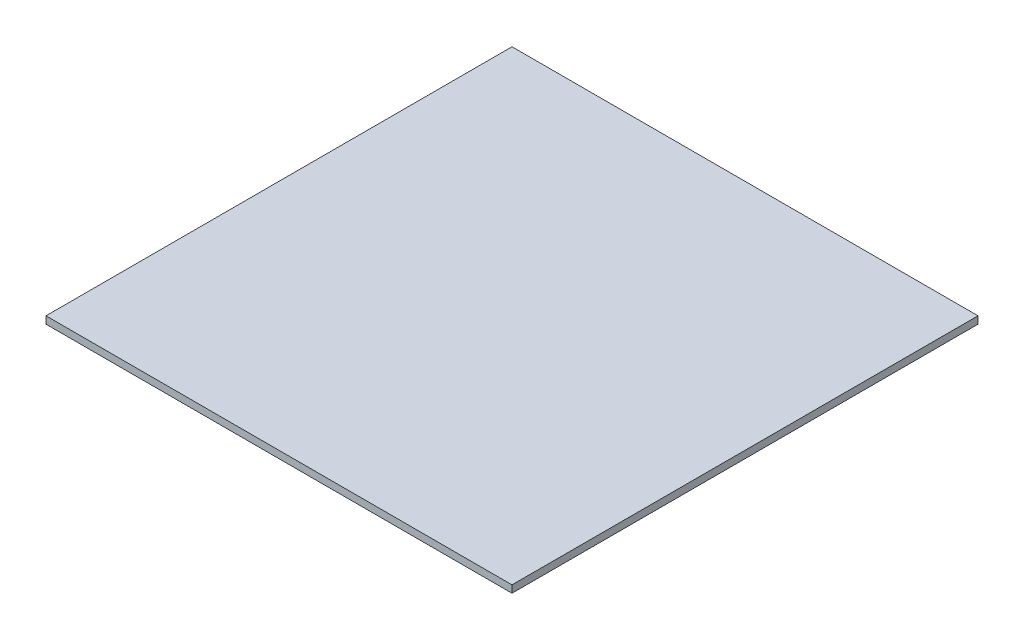
ISO-10303-21;
HEADER;
FILE_DESCRIPTION(('STEP AP214'),'2;1');
FILE_NAME('part.step','',(''),(''),'','','');
FILE_SCHEMA(('AUTOMOTIVE_DESIGN { 1 0 10303 214 1 1 1 1 }'));
ENDSEC;
DATA;
#1=APPLICATION_CONTEXT('core data for automotive mechanical design processes');
#2=APPLICATION_PROTOCOL_DEFINITION('international standard','automotive_design',2000,#1);
#3=PRODUCT_CONTEXT('',#1,'mechanical');
#4=PRODUCT('Part','Part','',(#3));
#5=PRODUCT_RELATED_PRODUCT_CATEGORY('part','',(#4));
#6=PRODUCT_DEFINITION_FORMATION('','',#4);
#7=PRODUCT_DEFINITION_CONTEXT('part definition',#1,'design');
#8=PRODUCT_DEFINITION('design','',#6,#7);
#9=PRODUCT_DEFINITION_SHAPE('','',#8);
#10=(LENGTH_UNIT() NAMED_UNIT(*) SI_UNIT(.MILLI.,.METRE.));
#11=(NAMED_UNIT(*) PLANE_ANGLE_UNIT() SI_UNIT($,.RADIAN.));
#12=(NAMED_UNIT(*) SI_UNIT($,.STERADIAN.) SOLID_ANGLE_UNIT());
#13=UNCERTAINTY_MEASURE_WITH_UNIT(LENGTH_MEASURE(1.E-05),#10,'distance_accuracy_value','');
#14=(GEOMETRIC_REPRESENTATION_CONTEXT(3) GLOBAL_UNCERTAINTY_ASSIGNED_CONTEXT((#13)) GLOBAL_UNIT_ASSIGNED_CONTEXT((#10,
#11,#12)) REPRESENTATION_CONTEXT('',''));
#15=CARTESIAN_POINT('',(0.,0.,0.));
#16=DIRECTION('',(0.,0.,1.));
#17=DIRECTION('',(1.,0.,0.));
#18=AXIS2_PLACEMENT_3D('',#15,#16,#17);
#19=CARTESIAN_POINT('',(101.6,3.175,101.6));
#20=DIRECTION('',(-1.,0.,0.));
#21=DIRECTION('',(0.,0.,1.));
#22=AXIS2_PLACEMENT_3D('',#19,#20,#21);
#23=PLANE('',#22);
#24=DIRECTION('',(0.,0.,-1.));
#25=VECTOR('',#24,1.);
#26=CARTESIAN_POINT('',(101.6,0.,101.6));
#27=LINE('',#26,#25);
#28=CARTESIAN_POINT('',(101.6,0.,101.6));
#29=VERTEX_POINT('',#28);
#30=CARTESIAN_POINT('',(101.6,0.,-101.6));
#31=VERTEX_POINT('',#30);
#32=EDGE_CURVE('E96',#29,#31,#27,.T.);
#33=ORIENTED_EDGE('',*,*,#32,.T.);
#34=DIRECTION('',(0.,-1.,0.));
#35=VECTOR('',#34,1.);
#36=CARTESIAN_POINT('',(101.6,3.175,-101.6));
#37=LINE('',#36,#35);
#38=CARTESIAN_POINT('',(101.6,3.175,-101.6));
#39=VERTEX_POINT('',#38);
#40=EDGE_CURVE('E11',#39,#31,#37,.T.);
#41=ORIENTED_EDGE('',*,*,#40,.F.);
#42=DIRECTION('',(0.,0.,-1.));
#43=VECTOR('',#42,1.);
#44=CARTESIAN_POINT('',(101.6,3.175,101.6));
#45=LINE('',#44,#43);
#46=CARTESIAN_POINT('',(101.6,3.175,101.6));
#47=VERTEX_POINT('',#46);
#48=EDGE_CURVE('E84',#47,#39,#45,.T.);
#49=ORIENTED_EDGE('',*,*,#48,.F.);
#50=DIRECTION('',(0.,-1.,0.));
#51=VECTOR('',#50,1.);
#52=CARTESIAN_POINT('',(101.6,3.175,101.6));
#53=LINE('',#52,#51);
#54=EDGE_CURVE('E92',#47,#29,#53,.T.);
#55=ORIENTED_EDGE('',*,*,#54,.T.);
#56=EDGE_LOOP('',(#33,#41,#49,#55));
#57=FACE_BOUND('',#56,.T.);
#58=ADVANCED_FACE('F33',(#57),#23,.F.);
#59=CARTESIAN_POINT('',(-101.6,3.175,-101.6));
#60=DIRECTION('',(0.,0.,1.));
#61=DIRECTION('',(1.,0.,0.));
#62=AXIS2_PLACEMENT_3D('',#59,#60,#61);
#63=PLANE('',#62);
#64=DIRECTION('',(-1.,0.,0.));
#65=VECTOR('',#64,1.);
#66=CARTESIAN_POINT('',(-101.6,0.,-101.6));
#67=LINE('',#66,#65);
#68=CARTESIAN_POINT('',(-101.6,0.,-101.6));
#69=VERTEX_POINT('',#68);
#70=EDGE_CURVE('E88',#31,#69,#67,.T.);
#71=ORIENTED_EDGE('',*,*,#70,.T.);
#72=DIRECTION('',(0.,-1.,0.));
#73=VECTOR('',#72,1.);
#74=CARTESIAN_POINT('',(-101.6,3.175,-101.6));
#75=LINE('',#74,#73);
#76=CARTESIAN_POINT('',(-101.6,3.175,-101.6));
#77=VERTEX_POINT('',#76);
#78=EDGE_CURVE('E41',#77,#69,#75,.T.);
#79=ORIENTED_EDGE('',*,*,#78,.F.);
#80=DIRECTION('',(-1.,0.,0.));
#81=VECTOR('',#80,1.);
#82=CARTESIAN_POINT('',(-101.6,3.175,-101.6));
#83=LINE('',#82,#81);
#84=EDGE_CURVE('E79',#39,#77,#83,.T.);
#85=ORIENTED_EDGE('',*,*,#84,.F.);
#86=ORIENTED_EDGE('',*,*,#40,.T.);
#87=EDGE_LOOP('',(#71,#79,#85,#86));
#88=FACE_BOUND('',#87,.T.);
#89=ADVANCED_FACE('F87',(#88),#63,.F.);
#90=CARTESIAN_POINT('',(-101.6,3.175,101.6));
#91=DIRECTION('',(1.,0.,0.));
#92=DIRECTION('',(0.,0.,-1.));
#93=AXIS2_PLACEMENT_3D('',#90,#91,#92);
#94=PLANE('',#93);
#95=DIRECTION('',(0.,0.,1.));
#96=VECTOR('',#95,1.);
#97=CARTESIAN_POINT('',(-101.6,0.,101.6));
#98=LINE('',#97,#96);
#99=CARTESIAN_POINT('',(-101.6,0.,101.6));
#100=VERTEX_POINT('',#99);
#101=EDGE_CURVE('E66',#69,#100,#98,.T.);
#102=ORIENTED_EDGE('',*,*,#101,.T.);
#103=DIRECTION('',(0.,-1.,0.));
#104=VECTOR('',#103,1.);
#105=CARTESIAN_POINT('',(-101.6,3.175,101.6));
#106=LINE('',#105,#104);
#107=CARTESIAN_POINT('',(-101.6,3.175,101.6));
#108=VERTEX_POINT('',#107);
#109=EDGE_CURVE('E89',#108,#100,#106,.T.);
#110=ORIENTED_EDGE('',*,*,#109,.F.);
#111=DIRECTION('',(0.,0.,1.));
#112=VECTOR('',#111,1.);
#113=CARTESIAN_POINT('',(-101.6,3.175,101.6));
#114=LINE('',#113,#112);
#115=EDGE_CURVE('E82',#77,#108,#114,.T.);
#116=ORIENTED_EDGE('',*,*,#115,.F.);
#117=ORIENTED_EDGE('',*,*,#78,.T.);
#118=EDGE_LOOP('',(#102,#110,#116,#117));
#119=FACE_BOUND('',#118,.T.);
#120=ADVANCED_FACE('F90',(#119),#94,.F.);
#121=CARTESIAN_POINT('',(-101.6,3.175,101.6));
#122=DIRECTION('',(0.,0.,-1.));
#123=DIRECTION('',(-1.,0.,0.));
#124=AXIS2_PLACEMENT_3D('',#121,#122,#123);
#125=PLANE('',#124);
#126=DIRECTION('',(1.,0.,0.));
#127=VECTOR('',#126,1.);
#128=CARTESIAN_POINT('',(-101.6,0.,101.6));
#129=LINE('',#128,#127);
#130=EDGE_CURVE('E72',#100,#29,#129,.T.);
#131=ORIENTED_EDGE('',*,*,#130,.T.);
#132=ORIENTED_EDGE('',*,*,#54,.F.);
#133=DIRECTION('',(1.,0.,0.));
#134=VECTOR('',#133,1.);
#135=CARTESIAN_POINT('',(-101.6,3.175,101.6));
#136=LINE('',#135,#134);
#137=EDGE_CURVE('E49',#108,#47,#136,.T.);
#138=ORIENTED_EDGE('',*,*,#137,.F.);
#139=ORIENTED_EDGE('',*,*,#109,.T.);
#140=EDGE_LOOP('',(#131,#132,#138,#139));
#141=FACE_BOUND('',#140,.T.);
#142=ADVANCED_FACE('F103',(#141),#125,.F.);
#143=CARTESIAN_POINT('',(0.,3.175,0.));
#144=DIRECTION('',(0.,-1.,0.));
#145=DIRECTION('',(0.,0.,-1.));
#146=AXIS2_PLACEMENT_3D('',#143,#144,#145);
#147=PLANE('',#146);
#148=ORIENTED_EDGE('',*,*,#48,.T.);
#149=ORIENTED_EDGE('',*,*,#84,.T.);
#150=ORIENTED_EDGE('',*,*,#115,.T.);
#151=ORIENTED_EDGE('',*,*,#137,.T.);
#152=EDGE_LOOP('',(#148,#149,#150,#151));
#153=FACE_BOUND('',#152,.T.);
#154=ADVANCED_FACE('F80',(#153),#147,.F.);
#155=CARTESIAN_POINT('',(0.,0.,0.));
#156=DIRECTION('',(0.,-1.,0.));
#157=DIRECTION('',(0.,0.,-1.));
#158=AXIS2_PLACEMENT_3D('',#155,#156,#157);
#159=PLANE('',#158);
#160=ORIENTED_EDGE('',*,*,#32,.F.);
#161=ORIENTED_EDGE('',*,*,#130,.F.);
#162=ORIENTED_EDGE('',*,*,#101,.F.);
#163=ORIENTED_EDGE('',*,*,#70,.F.);
#164=EDGE_LOOP('',(#160,#161,#162,#163));
#165=FACE_BOUND('',#164,.T.);
#166=ADVANCED_FACE('F106',(#165),#159,.T.);
#167=CLOSED_SHELL('',(#58,#89,#120,#142,#154,#166));
#168=MANIFOLD_SOLID_BREP('B2',#167);
#169=ADVANCED_BREP_SHAPE_REPRESENTATION('',(#18,#168),#14);
#170=SHAPE_DEFINITION_REPRESENTATION(#9,#169);
ENDSEC;
END-ISO-10303-21;
